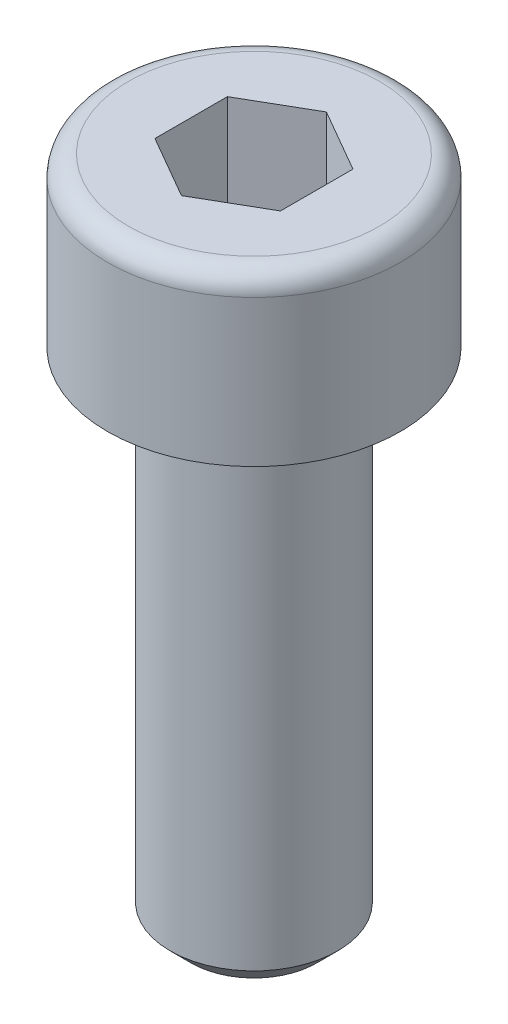
ISO-10303-21;
HEADER;
FILE_DESCRIPTION(('STEP AP214'),'2;1');
FILE_NAME('part.step','',(''),(''),'','','');
FILE_SCHEMA(('AUTOMOTIVE_DESIGN { 1 0 10303 214 1 1 1 1 }'));
ENDSEC;
DATA;
#1=APPLICATION_CONTEXT('core data for automotive mechanical design processes');
#2=APPLICATION_PROTOCOL_DEFINITION('international standard','automotive_design',2000,#1);
#3=PRODUCT_CONTEXT('',#1,'mechanical');
#4=PRODUCT('Part','Part','',(#3));
#5=PRODUCT_RELATED_PRODUCT_CATEGORY('part','',(#4));
#6=PRODUCT_DEFINITION_FORMATION('','',#4);
#7=PRODUCT_DEFINITION_CONTEXT('part definition',#1,'design');
#8=PRODUCT_DEFINITION('design','',#6,#7);
#9=PRODUCT_DEFINITION_SHAPE('','',#8);
#10=(LENGTH_UNIT() NAMED_UNIT(*) SI_UNIT(.MILLI.,.METRE.));
#11=(NAMED_UNIT(*) PLANE_ANGLE_UNIT() SI_UNIT($,.RADIAN.));
#12=(NAMED_UNIT(*) SI_UNIT($,.STERADIAN.) SOLID_ANGLE_UNIT());
#13=UNCERTAINTY_MEASURE_WITH_UNIT(LENGTH_MEASURE(1.E-05),#10,'distance_accuracy_value','');
#14=(GEOMETRIC_REPRESENTATION_CONTEXT(3) GLOBAL_UNCERTAINTY_ASSIGNED_CONTEXT((#13)) GLOBAL_UNIT_ASSIGNED_CONTEXT((#10,
#11,#12)) REPRESENTATION_CONTEXT('',''));
#15=CARTESIAN_POINT('',(0.,0.,0.));
#16=DIRECTION('',(0.,0.,1.));
#17=DIRECTION('',(1.,0.,0.));
#18=AXIS2_PLACEMENT_3D('',#15,#16,#17);
#19=CARTESIAN_POINT('',(0.,0.,0.));
#20=DIRECTION('',(0.,-1.,0.));
#21=DIRECTION('',(0.,0.,-1.));
#22=AXIS2_PLACEMENT_3D('',#19,#20,#21);
#23=PLANE('',#22);
#24=CARTESIAN_POINT('',(0.,0.,0.));
#25=DIRECTION('',(0.,-1.,0.));
#26=DIRECTION('',(0.,0.,-1.));
#27=AXIS2_PLACEMENT_3D('',#24,#25,#26);
#28=CIRCLE('',#27,3.);
#29=CARTESIAN_POINT('',(0.,0.,-3.));
#30=VERTEX_POINT('',#29);
#31=EDGE_CURVE('E43',#30,#30,#28,.F.);
#32=ORIENTED_EDGE('',*,*,#31,.T.);
#33=EDGE_LOOP('',(#32));
#34=FACE_BOUND('',#33,.T.);
#35=DIRECTION('',(-0.866025403784439,0.,-0.5));
#36=VECTOR('',#35,1.);
#37=CARTESIAN_POINT('',(1.5,0.,-0.866025403784438));
#38=LINE('',#37,#36);
#39=CARTESIAN_POINT('',(1.5,0.,-0.866025403784438));
#40=VERTEX_POINT('',#39);
#41=CARTESIAN_POINT('',(0.,0.,-1.73205080756888));
#42=VERTEX_POINT('',#41);
#43=EDGE_CURVE('E124',#40,#42,#38,.T.);
#44=ORIENTED_EDGE('',*,*,#43,.F.);
#45=DIRECTION('',(0.,0.,-1.));
#46=VECTOR('',#45,1.);
#47=CARTESIAN_POINT('',(1.5,0.,0.866025403784439));
#48=LINE('',#47,#46);
#49=CARTESIAN_POINT('',(1.5,0.,0.866025403784439));
#50=VERTEX_POINT('',#49);
#51=EDGE_CURVE('E50',#50,#40,#48,.T.);
#52=ORIENTED_EDGE('',*,*,#51,.F.);
#53=DIRECTION('',(0.866025403784439,0.,-0.5));
#54=VECTOR('',#53,1.);
#55=CARTESIAN_POINT('',(0.,0.,1.73205080756888));
#56=LINE('',#55,#54);
#57=CARTESIAN_POINT('',(0.,0.,1.73205080756888));
#58=VERTEX_POINT('',#57);
#59=EDGE_CURVE('E133',#58,#50,#56,.T.);
#60=ORIENTED_EDGE('',*,*,#59,.F.);
#61=DIRECTION('',(0.866025403784439,0.,0.5));
#62=VECTOR('',#61,1.);
#63=CARTESIAN_POINT('',(-1.5,0.,0.866025403784438));
#64=LINE('',#63,#62);
#65=CARTESIAN_POINT('',(-1.5,0.,0.866025403784438));
#66=VERTEX_POINT('',#65);
#67=EDGE_CURVE('E131',#66,#58,#64,.T.);
#68=ORIENTED_EDGE('',*,*,#67,.F.);
#69=DIRECTION('',(0.,0.,1.));
#70=VECTOR('',#69,1.);
#71=CARTESIAN_POINT('',(-1.5,0.,-0.866025403784439));
#72=LINE('',#71,#70);
#73=CARTESIAN_POINT('',(-1.5,0.,-0.866025403784439));
#74=VERTEX_POINT('',#73);
#75=EDGE_CURVE('E98',#74,#66,#72,.T.);
#76=ORIENTED_EDGE('',*,*,#75,.F.);
#77=DIRECTION('',(-0.866025403784439,0.,0.5));
#78=VECTOR('',#77,1.);
#79=CARTESIAN_POINT('',(0.,0.,-1.73205080756888));
#80=LINE('',#79,#78);
#81=EDGE_CURVE('E127',#42,#74,#80,.T.);
#82=ORIENTED_EDGE('',*,*,#81,.F.);
#83=EDGE_LOOP('',(#44,#52,#60,#68,#76,#82));
#84=FACE_BOUND('',#83,.T.);
#85=ADVANCED_FACE('F35',(#34,#84),#23,.F.);
#86=CARTESIAN_POINT('',(0.,0.,0.));
#87=DIRECTION('',(0.,1.,0.));
#88=DIRECTION('',(0.,0.,1.));
#89=AXIS2_PLACEMENT_3D('',#86,#87,#88);
#90=CYLINDRICAL_SURFACE('',#89,3.5);
#91=CARTESIAN_POINT('',(0.,-0.5,0.));
#92=DIRECTION('',(0.,-1.,0.));
#93=DIRECTION('',(0.,0.,-1.));
#94=AXIS2_PLACEMENT_3D('',#91,#92,#93);
#95=CIRCLE('',#94,3.5);
#96=CARTESIAN_POINT('',(0.,-0.5,-3.5));
#97=VERTEX_POINT('',#96);
#98=EDGE_CURVE('E11',#97,#97,#95,.T.);
#99=ORIENTED_EDGE('',*,*,#98,.T.);
#100=EDGE_LOOP('',(#99));
#101=FACE_BOUND('',#100,.T.);
#102=CARTESIAN_POINT('',(0.,-4.,0.));
#103=DIRECTION('',(0.,1.,0.));
#104=DIRECTION('',(0.,0.,1.));
#105=AXIS2_PLACEMENT_3D('',#102,#103,#104);
#106=CIRCLE('',#105,3.5);
#107=CARTESIAN_POINT('',(0.,-4.,3.5));
#108=VERTEX_POINT('',#107);
#109=EDGE_CURVE('E145',#108,#108,#106,.T.);
#110=ORIENTED_EDGE('',*,*,#109,.T.);
#111=EDGE_LOOP('',(#110));
#112=FACE_BOUND('',#111,.T.);
#113=ADVANCED_FACE('F167',(#101,#112),#90,.T.);
#114=CARTESIAN_POINT('',(3.5,-4.,0.));
#115=DIRECTION('',(0.,1.,0.));
#116=DIRECTION('',(0.,0.,1.));
#117=AXIS2_PLACEMENT_3D('',#114,#115,#116);
#118=PLANE('',#117);
#119=ORIENTED_EDGE('',*,*,#109,.F.);
#120=EDGE_LOOP('',(#119));
#121=FACE_BOUND('',#120,.T.);
#122=CARTESIAN_POINT('',(0.,-4.,0.));
#123=DIRECTION('',(0.,1.,0.));
#124=DIRECTION('',(0.,0.,1.));
#125=AXIS2_PLACEMENT_3D('',#122,#123,#124);
#126=CIRCLE('',#125,2.);
#127=CARTESIAN_POINT('',(0.,-4.,2.));
#128=VERTEX_POINT('',#127);
#129=EDGE_CURVE('E137',#128,#128,#126,.T.);
#130=ORIENTED_EDGE('',*,*,#129,.T.);
#131=EDGE_LOOP('',(#130));
#132=FACE_BOUND('',#131,.T.);
#133=ADVANCED_FACE('F172',(#121,#132),#118,.F.);
#134=CARTESIAN_POINT('',(0.,0.,0.));
#135=DIRECTION('',(0.,1.,0.));
#136=DIRECTION('',(0.,0.,1.));
#137=AXIS2_PLACEMENT_3D('',#134,#135,#136);
#138=CYLINDRICAL_SURFACE('',#137,2.);
#139=CARTESIAN_POINT('',(0.,-15.5,0.));
#140=DIRECTION('',(0.,1.,0.));
#141=DIRECTION('',(0.,0.,1.));
#142=AXIS2_PLACEMENT_3D('',#139,#140,#141);
#143=CIRCLE('',#142,2.);
#144=CARTESIAN_POINT('',(0.,-15.5,2.));
#145=VERTEX_POINT('',#144);
#146=EDGE_CURVE('E148',#145,#145,#143,.T.);
#147=ORIENTED_EDGE('',*,*,#146,.T.);
#148=EDGE_LOOP('',(#147));
#149=FACE_BOUND('',#148,.T.);
#150=ORIENTED_EDGE('',*,*,#129,.F.);
#151=EDGE_LOOP('',(#150));
#152=FACE_BOUND('',#151,.T.);
#153=ADVANCED_FACE('F178',(#149,#152),#138,.T.);
#154=CARTESIAN_POINT('',(2.,-16.,0.));
#155=DIRECTION('',(0.,1.,0.));
#156=DIRECTION('',(0.,0.,1.));
#157=AXIS2_PLACEMENT_3D('',#154,#155,#156);
#158=PLANE('',#157);
#159=CARTESIAN_POINT('',(0.,-16.,0.));
#160=DIRECTION('',(0.,1.,0.));
#161=DIRECTION('',(0.,0.,1.));
#162=AXIS2_PLACEMENT_3D('',#159,#160,#161);
#163=CIRCLE('',#162,1.5);
#164=CARTESIAN_POINT('',(0.,-16.,1.5));
#165=VERTEX_POINT('',#164);
#166=EDGE_CURVE('E151',#165,#165,#163,.F.);
#167=ORIENTED_EDGE('',*,*,#166,.T.);
#168=EDGE_LOOP('',(#167));
#169=FACE_BOUND('',#168,.T.);
#170=ADVANCED_FACE('F182',(#169),#158,.F.);
#171=CARTESIAN_POINT('',(1.5,-3.,0.866025403784439));
#172=DIRECTION('',(1.,0.,0.));
#173=DIRECTION('',(0.,0.,-1.));
#174=AXIS2_PLACEMENT_3D('',#171,#172,#173);
#175=PLANE('',#174);
#176=ORIENTED_EDGE('',*,*,#51,.T.);
#177=DIRECTION('',(0.,1.,0.));
#178=VECTOR('',#177,1.);
#179=CARTESIAN_POINT('',(1.5,-3.,-0.866025403784438));
#180=LINE('',#179,#178);
#181=CARTESIAN_POINT('',(1.5,-3.,-0.866025403784438));
#182=VERTEX_POINT('',#181);
#183=EDGE_CURVE('E80',#182,#40,#180,.T.);
#184=ORIENTED_EDGE('',*,*,#183,.F.);
#185=DIRECTION('',(0.,0.,-1.));
#186=VECTOR('',#185,1.);
#187=CARTESIAN_POINT('',(1.5,-3.,0.866025403784439));
#188=LINE('',#187,#186);
#189=CARTESIAN_POINT('',(1.5,-3.,0.866025403784439));
#190=VERTEX_POINT('',#189);
#191=EDGE_CURVE('E135',#190,#182,#188,.T.);
#192=ORIENTED_EDGE('',*,*,#191,.F.);
#193=DIRECTION('',(0.,1.,0.));
#194=VECTOR('',#193,1.);
#195=CARTESIAN_POINT('',(1.5,-3.,0.866025403784439));
#196=LINE('',#195,#194);
#197=EDGE_CURVE('E58',#190,#50,#196,.T.);
#198=ORIENTED_EDGE('',*,*,#197,.T.);
#199=EDGE_LOOP('',(#176,#184,#192,#198));
#200=FACE_BOUND('',#199,.T.);
#201=ADVANCED_FACE('F186',(#200),#175,.F.);
#202=CARTESIAN_POINT('',(0.,-3.,1.73205080756888));
#203=DIRECTION('',(0.5,0.,0.866025403784439));
#204=DIRECTION('',(0.866025403784439,0.,-0.5));
#205=AXIS2_PLACEMENT_3D('',#202,#203,#204);
#206=PLANE('',#205);
#207=ORIENTED_EDGE('',*,*,#59,.T.);
#208=ORIENTED_EDGE('',*,*,#197,.F.);
#209=DIRECTION('',(0.866025403784439,0.,-0.5));
#210=VECTOR('',#209,1.);
#211=CARTESIAN_POINT('',(0.,-3.,1.73205080756888));
#212=LINE('',#211,#210);
#213=CARTESIAN_POINT('',(0.,-3.,1.73205080756888));
#214=VERTEX_POINT('',#213);
#215=EDGE_CURVE('E110',#214,#190,#212,.T.);
#216=ORIENTED_EDGE('',*,*,#215,.F.);
#217=DIRECTION('',(0.,1.,0.));
#218=VECTOR('',#217,1.);
#219=CARTESIAN_POINT('',(0.,-3.,1.73205080756888));
#220=LINE('',#219,#218);
#221=EDGE_CURVE('E102',#214,#58,#220,.T.);
#222=ORIENTED_EDGE('',*,*,#221,.T.);
#223=EDGE_LOOP('',(#207,#208,#216,#222));
#224=FACE_BOUND('',#223,.T.);
#225=ADVANCED_FACE('F190',(#224),#206,.F.);
#226=CARTESIAN_POINT('',(-1.5,-3.,0.866025403784438));
#227=DIRECTION('',(-0.5,0.,0.866025403784438));
#228=DIRECTION('',(0.866025403784439,0.,0.5));
#229=AXIS2_PLACEMENT_3D('',#226,#227,#228);
#230=PLANE('',#229);
#231=ORIENTED_EDGE('',*,*,#67,.T.);
#232=ORIENTED_EDGE('',*,*,#221,.F.);
#233=DIRECTION('',(0.866025403784439,0.,0.5));
#234=VECTOR('',#233,1.);
#235=CARTESIAN_POINT('',(-1.5,-3.,0.866025403784438));
#236=LINE('',#235,#234);
#237=CARTESIAN_POINT('',(-1.5,-3.,0.866025403784438));
#238=VERTEX_POINT('',#237);
#239=EDGE_CURVE('E106',#238,#214,#236,.T.);
#240=ORIENTED_EDGE('',*,*,#239,.F.);
#241=DIRECTION('',(0.,1.,0.));
#242=VECTOR('',#241,1.);
#243=CARTESIAN_POINT('',(-1.5,-3.,0.866025403784438));
#244=LINE('',#243,#242);
#245=EDGE_CURVE('E91',#238,#66,#244,.T.);
#246=ORIENTED_EDGE('',*,*,#245,.T.);
#247=EDGE_LOOP('',(#231,#232,#240,#246));
#248=FACE_BOUND('',#247,.T.);
#249=ADVANCED_FACE('F107',(#248),#230,.F.);
#250=CARTESIAN_POINT('',(-1.5,-3.,-0.866025403784439));
#251=DIRECTION('',(-1.,0.,0.));
#252=DIRECTION('',(0.,0.,1.));
#253=AXIS2_PLACEMENT_3D('',#250,#251,#252);
#254=PLANE('',#253);
#255=ORIENTED_EDGE('',*,*,#75,.T.);
#256=ORIENTED_EDGE('',*,*,#245,.F.);
#257=DIRECTION('',(0.,0.,1.));
#258=VECTOR('',#257,1.);
#259=CARTESIAN_POINT('',(-1.5,-3.,-0.866025403784439));
#260=LINE('',#259,#258);
#261=CARTESIAN_POINT('',(-1.5,-3.,-0.866025403784439));
#262=VERTEX_POINT('',#261);
#263=EDGE_CURVE('E95',#262,#238,#260,.T.);
#264=ORIENTED_EDGE('',*,*,#263,.F.);
#265=DIRECTION('',(0.,1.,0.));
#266=VECTOR('',#265,1.);
#267=CARTESIAN_POINT('',(-1.5,-3.,-0.866025403784439));
#268=LINE('',#267,#266);
#269=EDGE_CURVE('E103',#262,#74,#268,.T.);
#270=ORIENTED_EDGE('',*,*,#269,.T.);
#271=EDGE_LOOP('',(#255,#256,#264,#270));
#272=FACE_BOUND('',#271,.T.);
#273=ADVANCED_FACE('F93',(#272),#254,.F.);
#274=CARTESIAN_POINT('',(0.,-3.,-1.73205080756888));
#275=DIRECTION('',(-0.5,0.,-0.866025403784439));
#276=DIRECTION('',(-0.866025403784439,0.,0.5));
#277=AXIS2_PLACEMENT_3D('',#274,#275,#276);
#278=PLANE('',#277);
#279=ORIENTED_EDGE('',*,*,#81,.T.);
#280=ORIENTED_EDGE('',*,*,#269,.F.);
#281=DIRECTION('',(-0.866025403784439,0.,0.5));
#282=VECTOR('',#281,1.);
#283=CARTESIAN_POINT('',(0.,-3.,-1.73205080756888));
#284=LINE('',#283,#282);
#285=CARTESIAN_POINT('',(0.,-3.,-1.73205080756888));
#286=VERTEX_POINT('',#285);
#287=EDGE_CURVE('E116',#286,#262,#284,.T.);
#288=ORIENTED_EDGE('',*,*,#287,.F.);
#289=DIRECTION('',(0.,1.,0.));
#290=VECTOR('',#289,1.);
#291=CARTESIAN_POINT('',(0.,-3.,-1.73205080756888));
#292=LINE('',#291,#290);
#293=EDGE_CURVE('E140',#286,#42,#292,.T.);
#294=ORIENTED_EDGE('',*,*,#293,.T.);
#295=EDGE_LOOP('',(#279,#280,#288,#294));
#296=FACE_BOUND('',#295,.T.);
#297=ADVANCED_FACE('F194',(#296),#278,.F.);
#298=CARTESIAN_POINT('',(1.5,-3.,-0.866025403784438));
#299=DIRECTION('',(0.5,0.,-0.866025403784439));
#300=DIRECTION('',(-0.866025403784439,0.,-0.5));
#301=AXIS2_PLACEMENT_3D('',#298,#299,#300);
#302=PLANE('',#301);
#303=ORIENTED_EDGE('',*,*,#43,.T.);
#304=ORIENTED_EDGE('',*,*,#293,.F.);
#305=DIRECTION('',(-0.866025403784439,0.,-0.5));
#306=VECTOR('',#305,1.);
#307=CARTESIAN_POINT('',(1.5,-3.,-0.866025403784438));
#308=LINE('',#307,#306);
#309=EDGE_CURVE('E118',#182,#286,#308,.T.);
#310=ORIENTED_EDGE('',*,*,#309,.F.);
#311=ORIENTED_EDGE('',*,*,#183,.T.);
#312=EDGE_LOOP('',(#303,#304,#310,#311));
#313=FACE_BOUND('',#312,.T.);
#314=ADVANCED_FACE('F191',(#313),#302,.F.);
#315=CARTESIAN_POINT('',(1.5,-3.,-0.866025403784438));
#316=DIRECTION('',(0.,1.,0.));
#317=DIRECTION('',(0.,0.,1.));
#318=AXIS2_PLACEMENT_3D('',#315,#316,#317);
#319=PLANE('',#318);
#320=ORIENTED_EDGE('',*,*,#191,.T.);
#321=ORIENTED_EDGE('',*,*,#309,.T.);
#322=ORIENTED_EDGE('',*,*,#287,.T.);
#323=ORIENTED_EDGE('',*,*,#263,.T.);
#324=ORIENTED_EDGE('',*,*,#239,.T.);
#325=ORIENTED_EDGE('',*,*,#215,.T.);
#326=EDGE_LOOP('',(#320,#321,#322,#323,#324,#325));
#327=FACE_BOUND('',#326,.T.);
#328=ADVANCED_FACE('F113',(#327),#319,.T.);
#329=CARTESIAN_POINT('',(0.,-15.5,0.));
#330=DIRECTION('',(0.,1.,0.));
#331=DIRECTION('',(0.,0.,1.));
#332=AXIS2_PLACEMENT_3D('',#329,#330,#331);
#333=CONICAL_SURFACE('',#332,2.,0.785398163397451);
#334=ORIENTED_EDGE('',*,*,#166,.F.);
#335=EDGE_LOOP('',(#334));
#336=FACE_BOUND('',#335,.T.);
#337=ORIENTED_EDGE('',*,*,#146,.F.);
#338=EDGE_LOOP('',(#337));
#339=FACE_BOUND('',#338,.T.);
#340=ADVANCED_FACE('F159',(#336,#339),#333,.T.);
#341=CARTESIAN_POINT('',(0.,-0.5,0.));
#342=DIRECTION('',(0.,-1.,0.));
#343=DIRECTION('',(0.,0.,-1.));
#344=AXIS2_PLACEMENT_3D('',#341,#342,#343);
#345=TOROIDAL_SURFACE('',#344,3.,0.5);
#346=ORIENTED_EDGE('',*,*,#98,.F.);
#347=EDGE_LOOP('',(#346));
#348=FACE_BOUND('',#347,.T.);
#349=ORIENTED_EDGE('',*,*,#31,.F.);
#350=EDGE_LOOP('',(#349));
#351=FACE_BOUND('',#350,.T.);
#352=ADVANCED_FACE('F37',(#348,#351),#345,.T.);
#353=CLOSED_SHELL('',(#85,#113,#133,#153,#170,#201,#225,#249,#273,#297,#314,#328,#340,#352));
#354=MANIFOLD_SOLID_BREP('B2',#353);
#355=ADVANCED_BREP_SHAPE_REPRESENTATION('',(#18,#354),#14);
#356=SHAPE_DEFINITION_REPRESENTATION(#9,#355);
ENDSEC;
END-ISO-10303-21;
